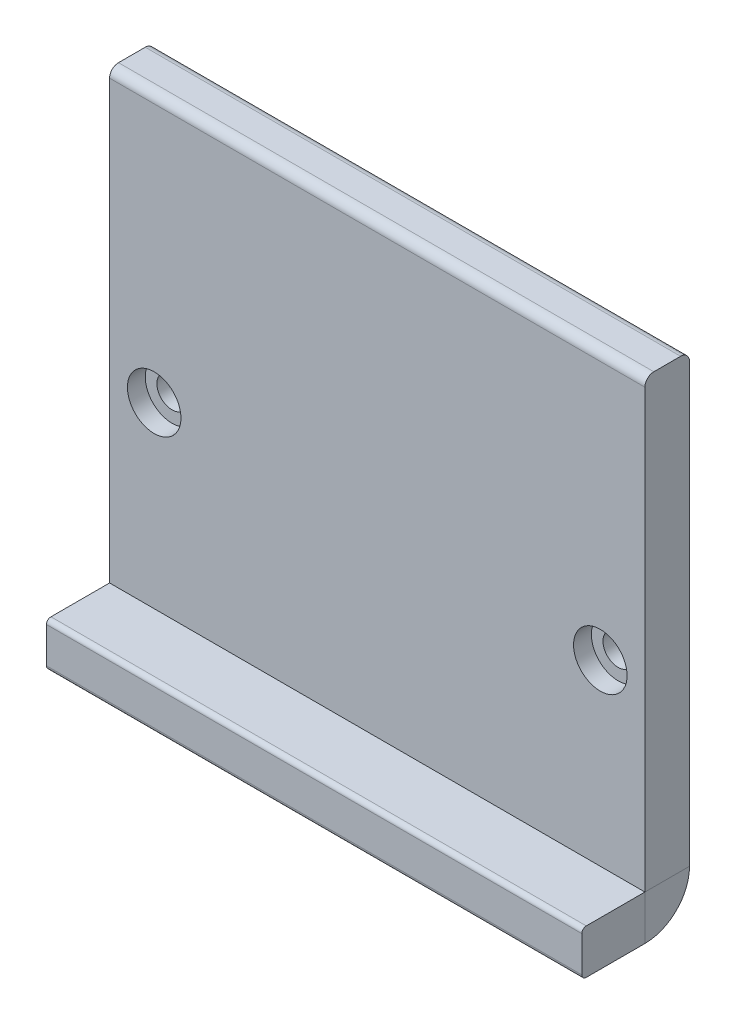
ISO-10303-21;
HEADER;
FILE_DESCRIPTION(('STEP AP214'),'2;1');
FILE_NAME('part.step','',(''),(''),'','','');
FILE_SCHEMA(('AUTOMOTIVE_DESIGN { 1 0 10303 214 1 1 1 1 }'));
ENDSEC;
DATA;
#1=APPLICATION_CONTEXT('core data for automotive mechanical design processes');
#2=APPLICATION_PROTOCOL_DEFINITION('international standard','automotive_design',2000,#1);
#3=PRODUCT_CONTEXT('',#1,'mechanical');
#4=PRODUCT('Part','Part','',(#3));
#5=PRODUCT_RELATED_PRODUCT_CATEGORY('part','',(#4));
#6=PRODUCT_DEFINITION_FORMATION('','',#4);
#7=PRODUCT_DEFINITION_CONTEXT('part definition',#1,'design');
#8=PRODUCT_DEFINITION('design','',#6,#7);
#9=PRODUCT_DEFINITION_SHAPE('','',#8);
#10=(LENGTH_UNIT() NAMED_UNIT(*) SI_UNIT(.MILLI.,.METRE.));
#11=(NAMED_UNIT(*) PLANE_ANGLE_UNIT() SI_UNIT($,.RADIAN.));
#12=(NAMED_UNIT(*) SI_UNIT($,.STERADIAN.) SOLID_ANGLE_UNIT());
#13=UNCERTAINTY_MEASURE_WITH_UNIT(LENGTH_MEASURE(1.E-05),#10,'distance_accuracy_value','');
#14=(GEOMETRIC_REPRESENTATION_CONTEXT(3) GLOBAL_UNCERTAINTY_ASSIGNED_CONTEXT((#13)) GLOBAL_UNIT_ASSIGNED_CONTEXT((#10,
#11,#12)) REPRESENTATION_CONTEXT('',''));
#15=CARTESIAN_POINT('',(0.,0.,0.));
#16=DIRECTION('',(0.,0.,1.));
#17=DIRECTION('',(1.,0.,0.));
#18=AXIS2_PLACEMENT_3D('',#15,#16,#17);
#19=CARTESIAN_POINT('',(30.,-25.,5.));
#20=DIRECTION('',(-1.,0.,0.));
#21=DIRECTION('',(0.,0.,1.));
#22=AXIS2_PLACEMENT_3D('',#19,#20,#21);
#23=CYLINDRICAL_SURFACE('',#22,5.);
#24=CARTESIAN_POINT('',(-30.,-25.,5.));
#25=DIRECTION('',(-1.,0.,0.));
#26=DIRECTION('',(0.,0.,1.));
#27=AXIS2_PLACEMENT_3D('',#24,#25,#26);
#28=CIRCLE('',#27,5.);
#29=CARTESIAN_POINT('',(-30.,-25.,0.));
#30=VERTEX_POINT('',#29);
#31=CARTESIAN_POINT('',(-30.,-30.,5.00000000000002));
#32=VERTEX_POINT('',#31);
#33=EDGE_CURVE('E98',#30,#32,#28,.T.);
#34=ORIENTED_EDGE('',*,*,#33,.F.);
#35=DIRECTION('',(-1.,0.,0.));
#36=VECTOR('',#35,1.);
#37=CARTESIAN_POINT('',(30.,-25.,0.));
#38=LINE('',#37,#36);
#39=CARTESIAN_POINT('',(30.,-25.,0.));
#40=VERTEX_POINT('',#39);
#41=EDGE_CURVE('E12',#40,#30,#38,.T.);
#42=ORIENTED_EDGE('',*,*,#41,.F.);
#43=CARTESIAN_POINT('',(30.,-25.,5.));
#44=DIRECTION('',(-1.,0.,0.));
#45=DIRECTION('',(0.,0.,1.));
#46=AXIS2_PLACEMENT_3D('',#43,#44,#45);
#47=CIRCLE('',#46,5.);
#48=CARTESIAN_POINT('',(30.,-30.,5.00000000000002));
#49=VERTEX_POINT('',#48);
#50=EDGE_CURVE('E90',#40,#49,#47,.T.);
#51=ORIENTED_EDGE('',*,*,#50,.T.);
#52=DIRECTION('',(-1.,0.,0.));
#53=VECTOR('',#52,1.);
#54=CARTESIAN_POINT('',(30.,-30.,5.00000000000002));
#55=LINE('',#54,#53);
#56=EDGE_CURVE('E49',#49,#32,#55,.T.);
#57=ORIENTED_EDGE('',*,*,#56,.T.);
#58=EDGE_LOOP('',(#34,#42,#51,#57));
#59=FACE_BOUND('',#58,.T.);
#60=ADVANCED_FACE('F46',(#59),#23,.T.);
#61=CARTESIAN_POINT('',(30.,-25.,5.));
#62=DIRECTION('',(0.,1.,0.));
#63=DIRECTION('',(0.,0.,1.));
#64=AXIS2_PLACEMENT_3D('',#61,#62,#63);
#65=PLANE('',#64);
#66=DIRECTION('',(0.,0.,-1.));
#67=VECTOR('',#66,1.);
#68=CARTESIAN_POINT('',(-30.,-25.,5.));
#69=LINE('',#68,#67);
#70=CARTESIAN_POINT('',(-30.,-25.,5.));
#71=VERTEX_POINT('',#70);
#72=EDGE_CURVE('E92',#71,#30,#69,.T.);
#73=ORIENTED_EDGE('',*,*,#72,.F.);
#74=DIRECTION('',(-1.,0.,0.));
#75=VECTOR('',#74,1.);
#76=CARTESIAN_POINT('',(30.,-25.,5.));
#77=LINE('',#76,#75);
#78=CARTESIAN_POINT('',(30.,-25.,5.));
#79=VERTEX_POINT('',#78);
#80=EDGE_CURVE('E55',#79,#71,#77,.T.);
#81=ORIENTED_EDGE('',*,*,#80,.F.);
#82=DIRECTION('',(0.,0.,-1.));
#83=VECTOR('',#82,1.);
#84=CARTESIAN_POINT('',(30.,-25.,5.));
#85=LINE('',#84,#83);
#86=EDGE_CURVE('E87',#79,#40,#85,.T.);
#87=ORIENTED_EDGE('',*,*,#86,.T.);
#88=ORIENTED_EDGE('',*,*,#41,.T.);
#89=EDGE_LOOP('',(#73,#81,#87,#88));
#90=FACE_BOUND('',#89,.T.);
#91=ADVANCED_FACE('F102',(#90),#65,.T.);
#92=CARTESIAN_POINT('',(30.,-30.,5.00000000000002));
#93=DIRECTION('',(0.,0.,1.));
#94=DIRECTION('',(0.,-1.,0.));
#95=AXIS2_PLACEMENT_3D('',#92,#93,#94);
#96=PLANE('',#95);
#97=DIRECTION('',(0.,1.,0.));
#98=VECTOR('',#97,1.);
#99=CARTESIAN_POINT('',(-30.,-30.,5.00000000000002));
#100=LINE('',#99,#98);
#101=EDGE_CURVE('E85',#32,#71,#100,.T.);
#102=ORIENTED_EDGE('',*,*,#101,.F.);
#103=ORIENTED_EDGE('',*,*,#56,.F.);
#104=DIRECTION('',(0.,1.,0.));
#105=VECTOR('',#104,1.);
#106=CARTESIAN_POINT('',(30.,-30.,5.00000000000002));
#107=LINE('',#106,#105);
#108=EDGE_CURVE('E83',#49,#79,#107,.T.);
#109=ORIENTED_EDGE('',*,*,#108,.T.);
#110=ORIENTED_EDGE('',*,*,#80,.T.);
#111=EDGE_LOOP('',(#102,#103,#109,#110));
#112=FACE_BOUND('',#111,.T.);
#113=ADVANCED_FACE('F82',(#112),#96,.T.);
#114=CARTESIAN_POINT('',(30.,-25.,5.));
#115=DIRECTION('',(-1.,0.,0.));
#116=DIRECTION('',(0.,0.,1.));
#117=AXIS2_PLACEMENT_3D('',#114,#115,#116);
#118=PLANE('',#117);
#119=ORIENTED_EDGE('',*,*,#50,.F.);
#120=ORIENTED_EDGE('',*,*,#86,.F.);
#121=ORIENTED_EDGE('',*,*,#108,.F.);
#122=EDGE_LOOP('',(#119,#120,#121));
#123=FACE_BOUND('',#122,.T.);
#124=ADVANCED_FACE('F89',(#123),#118,.F.);
#125=CARTESIAN_POINT('',(-30.,-25.,5.));
#126=DIRECTION('',(-1.,0.,0.));
#127=DIRECTION('',(0.,0.,1.));
#128=AXIS2_PLACEMENT_3D('',#125,#126,#127);
#129=PLANE('',#128);
#130=ORIENTED_EDGE('',*,*,#33,.T.);
#131=ORIENTED_EDGE('',*,*,#101,.T.);
#132=ORIENTED_EDGE('',*,*,#72,.T.);
#133=EDGE_LOOP('',(#130,#131,#132));
#134=FACE_BOUND('',#133,.T.);
#135=ADVANCED_FACE('F101',(#134),#129,.T.);
#136=CLOSED_SHELL('',(#60,#91,#113,#124,#135));
#137=MANIFOLD_SOLID_BREP('B2',#136);
#138=CARTESIAN_POINT('',(30.,-25.,5.));
#139=DIRECTION('',(0.,1.,0.));
#140=DIRECTION('',(0.,0.,1.));
#141=AXIS2_PLACEMENT_3D('',#138,#139,#140);
#142=PLANE('',#141);
#143=DIRECTION('',(0.,0.,-1.));
#144=VECTOR('',#143,1.);
#145=CARTESIAN_POINT('',(-30.,-25.,5.));
#146=LINE('',#145,#144);
#147=CARTESIAN_POINT('',(-30.,-25.,11.57));
#148=VERTEX_POINT('',#147);
#149=CARTESIAN_POINT('',(-30.,-25.,5.));
#150=VERTEX_POINT('',#149);
#151=EDGE_CURVE('E240',#148,#150,#146,.T.);
#152=ORIENTED_EDGE('',*,*,#151,.F.);
#153=DIRECTION('',(-1.,0.,0.));
#154=VECTOR('',#153,1.);
#155=CARTESIAN_POINT('',(30.,-25.,11.57));
#156=LINE('',#155,#154);
#157=CARTESIAN_POINT('',(30.,-25.,11.57));
#158=VERTEX_POINT('',#157);
#159=EDGE_CURVE('E168',#158,#148,#156,.T.);
#160=ORIENTED_EDGE('',*,*,#159,.F.);
#161=DIRECTION('',(0.,0.,-1.));
#162=VECTOR('',#161,1.);
#163=CARTESIAN_POINT('',(30.,-25.,5.));
#164=LINE('',#163,#162);
#165=CARTESIAN_POINT('',(30.,-25.,5.));
#166=VERTEX_POINT('',#165);
#167=EDGE_CURVE('E221',#158,#166,#164,.T.);
#168=ORIENTED_EDGE('',*,*,#167,.T.);
#169=DIRECTION('',(-1.,0.,0.));
#170=VECTOR('',#169,1.);
#171=CARTESIAN_POINT('',(30.,-25.,5.));
#172=LINE('',#171,#170);
#173=EDGE_CURVE('E44',#166,#150,#172,.T.);
#174=ORIENTED_EDGE('',*,*,#173,.T.);
#175=EDGE_LOOP('',(#152,#160,#168,#174));
#176=FACE_BOUND('',#175,.T.);
#177=ADVANCED_FACE('F153',(#176),#142,.T.);
#178=CARTESIAN_POINT('',(30.,-30.,12.07));
#179=DIRECTION('',(0.,0.,1.));
#180=DIRECTION('',(0.,-1.,0.));
#181=AXIS2_PLACEMENT_3D('',#178,#179,#180);
#182=PLANE('',#181);
#183=DIRECTION('',(-1.,0.,0.));
#184=VECTOR('',#183,1.);
#185=CARTESIAN_POINT('',(30.,-25.5,12.07));
#186=LINE('',#185,#184);
#187=CARTESIAN_POINT('',(30.,-25.5,12.07));
#188=VERTEX_POINT('',#187);
#189=CARTESIAN_POINT('',(-30.,-25.5,12.07));
#190=VERTEX_POINT('',#189);
#191=EDGE_CURVE('E204',#188,#190,#186,.T.);
#192=ORIENTED_EDGE('',*,*,#191,.T.);
#193=DIRECTION('',(0.,1.,0.));
#194=VECTOR('',#193,1.);
#195=CARTESIAN_POINT('',(-30.,-30.,12.07));
#196=LINE('',#195,#194);
#197=CARTESIAN_POINT('',(-30.,-29.5,12.07));
#198=VERTEX_POINT('',#197);
#199=EDGE_CURVE('E238',#198,#190,#196,.T.);
#200=ORIENTED_EDGE('',*,*,#199,.F.);
#201=DIRECTION('',(-1.,0.,0.));
#202=VECTOR('',#201,1.);
#203=CARTESIAN_POINT('',(30.,-29.5,12.07));
#204=LINE('',#203,#202);
#205=CARTESIAN_POINT('',(30.,-29.5,12.07));
#206=VERTEX_POINT('',#205);
#207=EDGE_CURVE('E176',#206,#198,#204,.T.);
#208=ORIENTED_EDGE('',*,*,#207,.F.);
#209=DIRECTION('',(0.,1.,0.));
#210=VECTOR('',#209,1.);
#211=CARTESIAN_POINT('',(30.,-30.,12.07));
#212=LINE('',#211,#210);
#213=EDGE_CURVE('E219',#206,#188,#212,.T.);
#214=ORIENTED_EDGE('',*,*,#213,.T.);
#215=EDGE_LOOP('',(#192,#200,#208,#214));
#216=FACE_BOUND('',#215,.T.);
#217=ADVANCED_FACE('F223',(#216),#182,.T.);
#218=CARTESIAN_POINT('',(30.,-25.,5.));
#219=DIRECTION('',(0.,0.,-1.));
#220=DIRECTION('',(0.,1.,0.));
#221=AXIS2_PLACEMENT_3D('',#218,#219,#220);
#222=PLANE('',#221);
#223=DIRECTION('',(0.,-1.,0.));
#224=VECTOR('',#223,1.);
#225=CARTESIAN_POINT('',(-30.,-25.,5.));
#226=LINE('',#225,#224);
#227=CARTESIAN_POINT('',(-30.,-30.,5.00000000000002));
#228=VERTEX_POINT('',#227);
#229=EDGE_CURVE('E232',#150,#228,#226,.T.);
#230=ORIENTED_EDGE('',*,*,#229,.F.);
#231=ORIENTED_EDGE('',*,*,#173,.F.);
#232=DIRECTION('',(0.,-1.,0.));
#233=VECTOR('',#232,1.);
#234=CARTESIAN_POINT('',(30.,-25.,5.));
#235=LINE('',#234,#233);
#236=CARTESIAN_POINT('',(30.,-30.,5.00000000000002));
#237=VERTEX_POINT('',#236);
#238=EDGE_CURVE('E228',#166,#237,#235,.T.);
#239=ORIENTED_EDGE('',*,*,#238,.T.);
#240=DIRECTION('',(-1.,0.,0.));
#241=VECTOR('',#240,1.);
#242=CARTESIAN_POINT('',(30.,-30.,5.00000000000002));
#243=LINE('',#242,#241);
#244=EDGE_CURVE('E157',#237,#228,#243,.T.);
#245=ORIENTED_EDGE('',*,*,#244,.T.);
#246=EDGE_LOOP('',(#230,#231,#239,#245));
#247=FACE_BOUND('',#246,.T.);
#248=ADVANCED_FACE('F155',(#247),#222,.T.);
#249=CARTESIAN_POINT('',(30.,-30.,5.00000000000002));
#250=DIRECTION('',(0.,-1.,0.));
#251=DIRECTION('',(0.,0.,-1.));
#252=AXIS2_PLACEMENT_3D('',#249,#250,#251);
#253=PLANE('',#252);
#254=DIRECTION('',(-1.,0.,0.));
#255=VECTOR('',#254,1.);
#256=CARTESIAN_POINT('',(30.,-30.,11.57));
#257=LINE('',#256,#255);
#258=CARTESIAN_POINT('',(30.,-30.,11.57));
#259=VERTEX_POINT('',#258);
#260=CARTESIAN_POINT('',(-30.,-30.,11.57));
#261=VERTEX_POINT('',#260);
#262=EDGE_CURVE('E247',#259,#261,#257,.T.);
#263=ORIENTED_EDGE('',*,*,#262,.T.);
#264=DIRECTION('',(0.,0.,1.));
#265=VECTOR('',#264,1.);
#266=CARTESIAN_POINT('',(-30.,-30.,5.00000000000002));
#267=LINE('',#266,#265);
#268=EDGE_CURVE('E235',#228,#261,#267,.T.);
#269=ORIENTED_EDGE('',*,*,#268,.F.);
#270=ORIENTED_EDGE('',*,*,#244,.F.);
#271=DIRECTION('',(0.,0.,1.));
#272=VECTOR('',#271,1.);
#273=CARTESIAN_POINT('',(30.,-30.,5.00000000000002));
#274=LINE('',#273,#272);
#275=EDGE_CURVE('E224',#237,#259,#274,.T.);
#276=ORIENTED_EDGE('',*,*,#275,.T.);
#277=EDGE_LOOP('',(#263,#269,#270,#276));
#278=FACE_BOUND('',#277,.T.);
#279=ADVANCED_FACE('F258',(#278),#253,.T.);
#280=CARTESIAN_POINT('',(30.,0.,0.));
#281=DIRECTION('',(-1.,0.,0.));
#282=DIRECTION('',(0.,0.,1.));
#283=AXIS2_PLACEMENT_3D('',#280,#281,#282);
#284=PLANE('',#283);
#285=ORIENTED_EDGE('',*,*,#167,.F.);
#286=CARTESIAN_POINT('',(30.,-25.5,11.57));
#287=DIRECTION('',(1.,0.,0.));
#288=DIRECTION('',(0.,0.,1.));
#289=AXIS2_PLACEMENT_3D('',#286,#287,#288);
#290=CIRCLE('',#289,0.500000000000007);
#291=EDGE_CURVE('E207',#158,#188,#290,.T.);
#292=ORIENTED_EDGE('',*,*,#291,.T.);
#293=ORIENTED_EDGE('',*,*,#213,.F.);
#294=CARTESIAN_POINT('',(30.,-29.5,11.57));
#295=DIRECTION('',(1.,0.,0.));
#296=DIRECTION('',(0.,0.,1.));
#297=AXIS2_PLACEMENT_3D('',#294,#295,#296);
#298=CIRCLE('',#297,0.5);
#299=EDGE_CURVE('E250',#206,#259,#298,.T.);
#300=ORIENTED_EDGE('',*,*,#299,.T.);
#301=ORIENTED_EDGE('',*,*,#275,.F.);
#302=ORIENTED_EDGE('',*,*,#238,.F.);
#303=EDGE_LOOP('',(#285,#292,#293,#300,#301,#302));
#304=FACE_BOUND('',#303,.T.);
#305=ADVANCED_FACE('F217',(#304),#284,.F.);
#306=CARTESIAN_POINT('',(-30.,0.,0.));
#307=DIRECTION('',(-1.,0.,0.));
#308=DIRECTION('',(0.,0.,1.));
#309=AXIS2_PLACEMENT_3D('',#306,#307,#308);
#310=PLANE('',#309);
#311=CARTESIAN_POINT('',(-30.,-25.5,11.57));
#312=DIRECTION('',(1.,0.,0.));
#313=DIRECTION('',(0.,0.,1.));
#314=AXIS2_PLACEMENT_3D('',#311,#312,#313);
#315=CIRCLE('',#314,0.500000000000007);
#316=EDGE_CURVE('E208',#148,#190,#315,.T.);
#317=ORIENTED_EDGE('',*,*,#316,.F.);
#318=ORIENTED_EDGE('',*,*,#151,.T.);
#319=ORIENTED_EDGE('',*,*,#229,.T.);
#320=ORIENTED_EDGE('',*,*,#268,.T.);
#321=CARTESIAN_POINT('',(-30.,-29.5,11.57));
#322=DIRECTION('',(1.,0.,0.));
#323=DIRECTION('',(0.,0.,1.));
#324=AXIS2_PLACEMENT_3D('',#321,#322,#323);
#325=CIRCLE('',#324,0.5);
#326=EDGE_CURVE('E252',#198,#261,#325,.T.);
#327=ORIENTED_EDGE('',*,*,#326,.F.);
#328=ORIENTED_EDGE('',*,*,#199,.T.);
#329=EDGE_LOOP('',(#317,#318,#319,#320,#327,#328));
#330=FACE_BOUND('',#329,.T.);
#331=ADVANCED_FACE('F261',(#330),#310,.T.);
#332=CARTESIAN_POINT('',(30.,-29.5,11.57));
#333=DIRECTION('',(-1.,0.,0.));
#334=DIRECTION('',(0.,0.,1.));
#335=AXIS2_PLACEMENT_3D('',#332,#333,#334);
#336=CYLINDRICAL_SURFACE('',#335,0.5);
#337=ORIENTED_EDGE('',*,*,#326,.T.);
#338=ORIENTED_EDGE('',*,*,#262,.F.);
#339=ORIENTED_EDGE('',*,*,#299,.F.);
#340=ORIENTED_EDGE('',*,*,#207,.T.);
#341=EDGE_LOOP('',(#337,#338,#339,#340));
#342=FACE_BOUND('',#341,.T.);
#343=ADVANCED_FACE('F262',(#342),#336,.T.);
#344=CARTESIAN_POINT('',(30.,-25.5,11.57));
#345=DIRECTION('',(-1.,0.,0.));
#346=DIRECTION('',(0.,0.,1.));
#347=AXIS2_PLACEMENT_3D('',#344,#345,#346);
#348=CYLINDRICAL_SURFACE('',#347,0.500000000000007);
#349=ORIENTED_EDGE('',*,*,#316,.T.);
#350=ORIENTED_EDGE('',*,*,#191,.F.);
#351=ORIENTED_EDGE('',*,*,#291,.F.);
#352=ORIENTED_EDGE('',*,*,#159,.T.);
#353=EDGE_LOOP('',(#349,#350,#351,#352));
#354=FACE_BOUND('',#353,.T.);
#355=ADVANCED_FACE('F206',(#354),#348,.T.);
#356=CLOSED_SHELL('',(#177,#217,#248,#279,#305,#331,#343,#355));
#357=MANIFOLD_SOLID_BREP('B6',#356);
#358=CARTESIAN_POINT('',(-30.,25.,5.));
#359=DIRECTION('',(0.,-1.,0.));
#360=DIRECTION('',(0.,0.,-1.));
#361=AXIS2_PLACEMENT_3D('',#358,#359,#360);
#362=PLANE('',#361);
#363=DIRECTION('',(0.,0.,-1.));
#364=VECTOR('',#363,1.);
#365=CARTESIAN_POINT('',(-30.,25.,5.));
#366=LINE('',#365,#364);
#367=CARTESIAN_POINT('',(-30.,25.,4.));
#368=VERTEX_POINT('',#367);
#369=CARTESIAN_POINT('',(-30.,25.,1.));
#370=VERTEX_POINT('',#369);
#371=EDGE_CURVE('E338',#368,#370,#366,.T.);
#372=ORIENTED_EDGE('',*,*,#371,.F.);
#373=DIRECTION('',(-1.,0.,0.));
#374=VECTOR('',#373,1.);
#375=CARTESIAN_POINT('',(30.,25.,4.));
#376=LINE('',#375,#374);
#377=CARTESIAN_POINT('',(30.,25.,4.));
#378=VERTEX_POINT('',#377);
#379=EDGE_CURVE('E389',#378,#368,#376,.T.);
#380=ORIENTED_EDGE('',*,*,#379,.F.);
#381=DIRECTION('',(0.,0.,-1.));
#382=VECTOR('',#381,1.);
#383=CARTESIAN_POINT('',(30.,25.,5.));
#384=LINE('',#383,#382);
#385=CARTESIAN_POINT('',(30.,25.,1.));
#386=VERTEX_POINT('',#385);
#387=EDGE_CURVE('E151',#378,#386,#384,.T.);
#388=ORIENTED_EDGE('',*,*,#387,.T.);
#389=DIRECTION('',(-1.,0.,0.));
#390=VECTOR('',#389,1.);
#391=CARTESIAN_POINT('',(30.,25.,1.));
#392=LINE('',#391,#390);
#393=EDGE_CURVE('E446',#386,#370,#392,.T.);
#394=ORIENTED_EDGE('',*,*,#393,.T.);
#395=EDGE_LOOP('',(#372,#380,#388,#394));
#396=FACE_BOUND('',#395,.T.);
#397=ADVANCED_FACE('F329',(#396),#362,.F.);
#398=CARTESIAN_POINT('',(0.,0.,5.));
#399=DIRECTION('',(0.,0.,-1.));
#400=DIRECTION('',(-1.,0.,0.));
#401=AXIS2_PLACEMENT_3D('',#398,#399,#400);
#402=PLANE('',#401);
#403=CARTESIAN_POINT('',(25.,-5.00000000000001,5.));
#404=DIRECTION('',(0.,0.,1.));
#405=DIRECTION('',(1.,0.,0.));
#406=AXIS2_PLACEMENT_3D('',#403,#404,#405);
#407=CIRCLE('',#406,3.);
#408=CARTESIAN_POINT('',(28.,-5.00000000000001,5.));
#409=VERTEX_POINT('',#408);
#410=EDGE_CURVE('E431',#409,#409,#407,.T.);
#411=ORIENTED_EDGE('',*,*,#410,.F.);
#412=EDGE_LOOP('',(#411));
#413=FACE_BOUND('',#412,.T.);
#414=CARTESIAN_POINT('',(-25.,-5.00000000000001,5.));
#415=DIRECTION('',(0.,0.,1.));
#416=DIRECTION('',(1.,0.,0.));
#417=AXIS2_PLACEMENT_3D('',#414,#415,#416);
#418=CIRCLE('',#417,3.);
#419=CARTESIAN_POINT('',(-22.,-5.00000000000001,5.));
#420=VERTEX_POINT('',#419);
#421=EDGE_CURVE('E443',#420,#420,#418,.T.);
#422=ORIENTED_EDGE('',*,*,#421,.F.);
#423=EDGE_LOOP('',(#422));
#424=FACE_BOUND('',#423,.T.);
#425=DIRECTION('',(-1.,0.,0.));
#426=VECTOR('',#425,1.);
#427=CARTESIAN_POINT('',(30.,24.,5.));
#428=LINE('',#427,#426);
#429=CARTESIAN_POINT('',(30.,24.,5.));
#430=VERTEX_POINT('',#429);
#431=CARTESIAN_POINT('',(-30.,24.,5.));
#432=VERTEX_POINT('',#431);
#433=EDGE_CURVE('E381',#430,#432,#428,.T.);
#434=ORIENTED_EDGE('',*,*,#433,.T.);
#435=DIRECTION('',(0.,-1.,0.));
#436=VECTOR('',#435,1.);
#437=CARTESIAN_POINT('',(-30.,-25.,5.));
#438=LINE('',#437,#436);
#439=CARTESIAN_POINT('',(-30.,-25.,5.));
#440=VERTEX_POINT('',#439);
#441=EDGE_CURVE('E401',#432,#440,#438,.T.);
#442=ORIENTED_EDGE('',*,*,#441,.T.);
#443=DIRECTION('',(1.,0.,0.));
#444=VECTOR('',#443,1.);
#445=CARTESIAN_POINT('',(-30.,-25.,5.));
#446=LINE('',#445,#444);
#447=CARTESIAN_POINT('',(30.,-25.,5.));
#448=VERTEX_POINT('',#447);
#449=EDGE_CURVE('E399',#440,#448,#446,.T.);
#450=ORIENTED_EDGE('',*,*,#449,.T.);
#451=DIRECTION('',(0.,1.,0.));
#452=VECTOR('',#451,1.);
#453=CARTESIAN_POINT('',(30.,-25.,5.));
#454=LINE('',#453,#452);
#455=EDGE_CURVE('E395',#448,#430,#454,.T.);
#456=ORIENTED_EDGE('',*,*,#455,.T.);
#457=EDGE_LOOP('',(#434,#442,#450,#456));
#458=FACE_BOUND('',#457,.T.);
#459=ADVANCED_FACE('F397',(#413,#424,#458),#402,.F.);
#460=CARTESIAN_POINT('',(0.,0.,0.));
#461=DIRECTION('',(0.,0.,-1.));
#462=DIRECTION('',(-1.,0.,0.));
#463=AXIS2_PLACEMENT_3D('',#460,#461,#462);
#464=PLANE('',#463);
#465=CARTESIAN_POINT('',(-25.,-5.00000000000001,0.));
#466=DIRECTION('',(0.,0.,-1.));
#467=DIRECTION('',(-1.,0.,0.));
#468=AXIS2_PLACEMENT_3D('',#465,#466,#467);
#469=CIRCLE('',#468,1.7);
#470=CARTESIAN_POINT('',(-26.7,-5.00000000000001,0.));
#471=VERTEX_POINT('',#470);
#472=EDGE_CURVE('E333',#471,#471,#469,.T.);
#473=ORIENTED_EDGE('',*,*,#472,.F.);
#474=EDGE_LOOP('',(#473));
#475=FACE_BOUND('',#474,.T.);
#476=CARTESIAN_POINT('',(25.,-5.00000000000001,0.));
#477=DIRECTION('',(0.,0.,-1.));
#478=DIRECTION('',(-1.,0.,0.));
#479=AXIS2_PLACEMENT_3D('',#476,#477,#478);
#480=CIRCLE('',#479,1.7);
#481=CARTESIAN_POINT('',(23.3,-5.00000000000001,0.));
#482=VERTEX_POINT('',#481);
#483=EDGE_CURVE('E416',#482,#482,#480,.T.);
#484=ORIENTED_EDGE('',*,*,#483,.F.);
#485=EDGE_LOOP('',(#484));
#486=FACE_BOUND('',#485,.T.);
#487=DIRECTION('',(0.,-1.,0.));
#488=VECTOR('',#487,1.);
#489=CARTESIAN_POINT('',(-30.,-25.,0.));
#490=LINE('',#489,#488);
#491=CARTESIAN_POINT('',(-30.,24.,0.));
#492=VERTEX_POINT('',#491);
#493=CARTESIAN_POINT('',(-30.,-25.,0.));
#494=VERTEX_POINT('',#493);
#495=EDGE_CURVE('E405',#492,#494,#490,.T.);
#496=ORIENTED_EDGE('',*,*,#495,.F.);
#497=DIRECTION('',(-1.,0.,0.));
#498=VECTOR('',#497,1.);
#499=CARTESIAN_POINT('',(30.,24.,0.));
#500=LINE('',#499,#498);
#501=CARTESIAN_POINT('',(30.,24.,0.));
#502=VERTEX_POINT('',#501);
#503=EDGE_CURVE('E449',#502,#492,#500,.T.);
#504=ORIENTED_EDGE('',*,*,#503,.F.);
#505=DIRECTION('',(0.,1.,0.));
#506=VECTOR('',#505,1.);
#507=CARTESIAN_POINT('',(30.,-25.,0.));
#508=LINE('',#507,#506);
#509=CARTESIAN_POINT('',(30.,-25.,0.));
#510=VERTEX_POINT('',#509);
#511=EDGE_CURVE('E413',#510,#502,#508,.T.);
#512=ORIENTED_EDGE('',*,*,#511,.F.);
#513=DIRECTION('',(1.,0.,0.));
#514=VECTOR('',#513,1.);
#515=CARTESIAN_POINT('',(-30.,-25.,0.));
#516=LINE('',#515,#514);
#517=EDGE_CURVE('E402',#494,#510,#516,.T.);
#518=ORIENTED_EDGE('',*,*,#517,.F.);
#519=EDGE_LOOP('',(#496,#504,#512,#518));
#520=FACE_BOUND('',#519,.T.);
#521=ADVANCED_FACE('F466',(#475,#486,#520),#464,.T.);
#522=CARTESIAN_POINT('',(30.,-25.,5.));
#523=DIRECTION('',(-1.,0.,0.));
#524=DIRECTION('',(0.,0.,1.));
#525=AXIS2_PLACEMENT_3D('',#522,#523,#524);
#526=PLANE('',#525);
#527=ORIENTED_EDGE('',*,*,#387,.F.);
#528=CARTESIAN_POINT('',(30.,24.,4.));
#529=DIRECTION('',(1.,0.,0.));
#530=DIRECTION('',(0.,0.,1.));
#531=AXIS2_PLACEMENT_3D('',#528,#529,#530);
#532=CIRCLE('',#531,1.);
#533=EDGE_CURVE('E384',#378,#430,#532,.T.);
#534=ORIENTED_EDGE('',*,*,#533,.T.);
#535=ORIENTED_EDGE('',*,*,#455,.F.);
#536=DIRECTION('',(0.,0.,-1.));
#537=VECTOR('',#536,1.);
#538=CARTESIAN_POINT('',(30.,-25.,5.));
#539=LINE('',#538,#537);
#540=EDGE_CURVE('E412',#448,#510,#539,.T.);
#541=ORIENTED_EDGE('',*,*,#540,.T.);
#542=ORIENTED_EDGE('',*,*,#511,.T.);
#543=CARTESIAN_POINT('',(30.,24.,1.));
#544=DIRECTION('',(1.,0.,0.));
#545=DIRECTION('',(0.,0.,1.));
#546=AXIS2_PLACEMENT_3D('',#543,#544,#545);
#547=CIRCLE('',#546,1.);
#548=EDGE_CURVE('E354',#502,#386,#547,.T.);
#549=ORIENTED_EDGE('',*,*,#548,.T.);
#550=EDGE_LOOP('',(#527,#534,#535,#541,#542,#549));
#551=FACE_BOUND('',#550,.T.);
#552=ADVANCED_FACE('F331',(#551),#526,.F.);
#553=CARTESIAN_POINT('',(-30.,-25.,5.));
#554=DIRECTION('',(1.,0.,0.));
#555=DIRECTION('',(0.,0.,-1.));
#556=AXIS2_PLACEMENT_3D('',#553,#554,#555);
#557=PLANE('',#556);
#558=ORIENTED_EDGE('',*,*,#441,.F.);
#559=CARTESIAN_POINT('',(-30.,24.,4.));
#560=DIRECTION('',(1.,0.,0.));
#561=DIRECTION('',(0.,0.,1.));
#562=AXIS2_PLACEMENT_3D('',#559,#560,#561);
#563=CIRCLE('',#562,1.);
#564=EDGE_CURVE('E346',#368,#432,#563,.T.);
#565=ORIENTED_EDGE('',*,*,#564,.F.);
#566=ORIENTED_EDGE('',*,*,#371,.T.);
#567=CARTESIAN_POINT('',(-30.,24.,1.));
#568=DIRECTION('',(1.,0.,0.));
#569=DIRECTION('',(0.,0.,1.));
#570=AXIS2_PLACEMENT_3D('',#567,#568,#569);
#571=CIRCLE('',#570,1.);
#572=EDGE_CURVE('E451',#492,#370,#571,.T.);
#573=ORIENTED_EDGE('',*,*,#572,.F.);
#574=ORIENTED_EDGE('',*,*,#495,.T.);
#575=DIRECTION('',(0.,0.,-1.));
#576=VECTOR('',#575,1.);
#577=CARTESIAN_POINT('',(-30.,-25.,5.));
#578=LINE('',#577,#576);
#579=EDGE_CURVE('E419',#440,#494,#578,.T.);
#580=ORIENTED_EDGE('',*,*,#579,.F.);
#581=EDGE_LOOP('',(#558,#565,#566,#573,#574,#580));
#582=FACE_BOUND('',#581,.T.);
#583=ADVANCED_FACE('F458',(#582),#557,.F.);
#584=CARTESIAN_POINT('',(-30.,-25.,5.));
#585=DIRECTION('',(0.,1.,0.));
#586=DIRECTION('',(0.,0.,1.));
#587=AXIS2_PLACEMENT_3D('',#584,#585,#586);
#588=PLANE('',#587);
#589=ORIENTED_EDGE('',*,*,#517,.T.);
#590=ORIENTED_EDGE('',*,*,#540,.F.);
#591=ORIENTED_EDGE('',*,*,#449,.F.);
#592=ORIENTED_EDGE('',*,*,#579,.T.);
#593=EDGE_LOOP('',(#589,#590,#591,#592));
#594=FACE_BOUND('',#593,.T.);
#595=ADVANCED_FACE('F468',(#594),#588,.F.);
#596=CARTESIAN_POINT('',(25.,-5.00000000000001,5.));
#597=DIRECTION('',(0.,0.,1.));
#598=DIRECTION('',(1.,0.,0.));
#599=AXIS2_PLACEMENT_3D('',#596,#597,#598);
#600=CYLINDRICAL_SURFACE('',#599,1.7);
#601=ORIENTED_EDGE('',*,*,#483,.T.);
#602=EDGE_LOOP('',(#601));
#603=FACE_BOUND('',#602,.T.);
#604=CARTESIAN_POINT('',(25.,-5.00000000000001,3.));
#605=DIRECTION('',(0.,0.,1.));
#606=DIRECTION('',(1.,0.,0.));
#607=AXIS2_PLACEMENT_3D('',#604,#605,#606);
#608=CIRCLE('',#607,1.7);
#609=CARTESIAN_POINT('',(26.7,-5.00000000000001,3.));
#610=VERTEX_POINT('',#609);
#611=EDGE_CURVE('E408',#610,#610,#608,.T.);
#612=ORIENTED_EDGE('',*,*,#611,.T.);
#613=EDGE_LOOP('',(#612));
#614=FACE_BOUND('',#613,.T.);
#615=ADVANCED_FACE('F470',(#603,#614),#600,.F.);
#616=CARTESIAN_POINT('',(26.7,-5.00000000000001,3.));
#617=DIRECTION('',(0.,0.,-1.));
#618=DIRECTION('',(-1.,0.,0.));
#619=AXIS2_PLACEMENT_3D('',#616,#617,#618);
#620=PLANE('',#619);
#621=ORIENTED_EDGE('',*,*,#611,.F.);
#622=EDGE_LOOP('',(#621));
#623=FACE_BOUND('',#622,.T.);
#624=CARTESIAN_POINT('',(25.,-5.00000000000001,3.));
#625=DIRECTION('',(0.,0.,1.));
#626=DIRECTION('',(1.,0.,0.));
#627=AXIS2_PLACEMENT_3D('',#624,#625,#626);
#628=CIRCLE('',#627,3.);
#629=CARTESIAN_POINT('',(28.,-5.00000000000001,3.));
#630=VERTEX_POINT('',#629);
#631=EDGE_CURVE('E427',#630,#630,#628,.T.);
#632=ORIENTED_EDGE('',*,*,#631,.T.);
#633=EDGE_LOOP('',(#632));
#634=FACE_BOUND('',#633,.T.);
#635=ADVANCED_FACE('F476',(#623,#634),#620,.F.);
#636=CARTESIAN_POINT('',(25.,-5.00000000000001,5.));
#637=DIRECTION('',(0.,0.,1.));
#638=DIRECTION('',(1.,0.,0.));
#639=AXIS2_PLACEMENT_3D('',#636,#637,#638);
#640=CYLINDRICAL_SURFACE('',#639,3.);
#641=ORIENTED_EDGE('',*,*,#631,.F.);
#642=EDGE_LOOP('',(#641));
#643=FACE_BOUND('',#642,.T.);
#644=ORIENTED_EDGE('',*,*,#410,.T.);
#645=EDGE_LOOP('',(#644));
#646=FACE_BOUND('',#645,.T.);
#647=ADVANCED_FACE('F495',(#643,#646),#640,.F.);
#648=CARTESIAN_POINT('',(-25.,-5.00000000000001,5.));
#649=DIRECTION('',(0.,0.,1.));
#650=DIRECTION('',(1.,0.,0.));
#651=AXIS2_PLACEMENT_3D('',#648,#649,#650);
#652=CYLINDRICAL_SURFACE('',#651,1.7);
#653=ORIENTED_EDGE('',*,*,#472,.T.);
#654=EDGE_LOOP('',(#653));
#655=FACE_BOUND('',#654,.T.);
#656=CARTESIAN_POINT('',(-25.,-5.00000000000001,3.));
#657=DIRECTION('',(0.,0.,1.));
#658=DIRECTION('',(1.,0.,0.));
#659=AXIS2_PLACEMENT_3D('',#656,#657,#658);
#660=CIRCLE('',#659,1.7);
#661=CARTESIAN_POINT('',(-23.3,-5.00000000000001,3.));
#662=VERTEX_POINT('',#661);
#663=EDGE_CURVE('E437',#662,#662,#660,.T.);
#664=ORIENTED_EDGE('',*,*,#663,.T.);
#665=EDGE_LOOP('',(#664));
#666=FACE_BOUND('',#665,.T.);
#667=ADVANCED_FACE('F499',(#655,#666),#652,.F.);
#668=CARTESIAN_POINT('',(-23.3,-5.00000000000001,3.));
#669=DIRECTION('',(0.,0.,-1.));
#670=DIRECTION('',(-1.,0.,0.));
#671=AXIS2_PLACEMENT_3D('',#668,#669,#670);
#672=PLANE('',#671);
#673=ORIENTED_EDGE('',*,*,#663,.F.);
#674=EDGE_LOOP('',(#673));
#675=FACE_BOUND('',#674,.T.);
#676=CARTESIAN_POINT('',(-25.,-5.00000000000001,3.));
#677=DIRECTION('',(0.,0.,1.));
#678=DIRECTION('',(1.,0.,0.));
#679=AXIS2_PLACEMENT_3D('',#676,#677,#678);
#680=CIRCLE('',#679,3.);
#681=CARTESIAN_POINT('',(-22.,-5.00000000000001,3.));
#682=VERTEX_POINT('',#681);
#683=EDGE_CURVE('E440',#682,#682,#680,.T.);
#684=ORIENTED_EDGE('',*,*,#683,.T.);
#685=EDGE_LOOP('',(#684));
#686=FACE_BOUND('',#685,.T.);
#687=ADVANCED_FACE('F503',(#675,#686),#672,.F.);
#688=CARTESIAN_POINT('',(-25.,-5.00000000000001,5.));
#689=DIRECTION('',(0.,0.,1.));
#690=DIRECTION('',(1.,0.,0.));
#691=AXIS2_PLACEMENT_3D('',#688,#689,#690);
#692=CYLINDRICAL_SURFACE('',#691,3.);
#693=ORIENTED_EDGE('',*,*,#683,.F.);
#694=EDGE_LOOP('',(#693));
#695=FACE_BOUND('',#694,.T.);
#696=ORIENTED_EDGE('',*,*,#421,.T.);
#697=EDGE_LOOP('',(#696));
#698=FACE_BOUND('',#697,.T.);
#699=ADVANCED_FACE('F507',(#695,#698),#692,.F.);
#700=CARTESIAN_POINT('',(30.,24.,1.));
#701=DIRECTION('',(-1.,0.,0.));
#702=DIRECTION('',(0.,0.,1.));
#703=AXIS2_PLACEMENT_3D('',#700,#701,#702);
#704=CYLINDRICAL_SURFACE('',#703,1.);
#705=ORIENTED_EDGE('',*,*,#572,.T.);
#706=ORIENTED_EDGE('',*,*,#393,.F.);
#707=ORIENTED_EDGE('',*,*,#548,.F.);
#708=ORIENTED_EDGE('',*,*,#503,.T.);
#709=EDGE_LOOP('',(#705,#706,#707,#708));
#710=FACE_BOUND('',#709,.T.);
#711=ADVANCED_FACE('F461',(#710),#704,.T.);
#712=CARTESIAN_POINT('',(30.,24.,4.));
#713=DIRECTION('',(-1.,0.,0.));
#714=DIRECTION('',(0.,0.,1.));
#715=AXIS2_PLACEMENT_3D('',#712,#713,#714);
#716=CYLINDRICAL_SURFACE('',#715,1.);
#717=ORIENTED_EDGE('',*,*,#564,.T.);
#718=ORIENTED_EDGE('',*,*,#433,.F.);
#719=ORIENTED_EDGE('',*,*,#533,.F.);
#720=ORIENTED_EDGE('',*,*,#379,.T.);
#721=EDGE_LOOP('',(#717,#718,#719,#720));
#722=FACE_BOUND('',#721,.T.);
#723=ADVANCED_FACE('F383',(#722),#716,.T.);
#724=CLOSED_SHELL('',(#397,#459,#521,#552,#583,#595,#615,#635,#647,#667,#687,#699,#711,#723));
#725=MANIFOLD_SOLID_BREP('B38',#724);
#726=ADVANCED_BREP_SHAPE_REPRESENTATION('',(#18,#137,#357,#725),#14);
#727=SHAPE_DEFINITION_REPRESENTATION(#9,#726);
ENDSEC;
END-ISO-10303-21;
